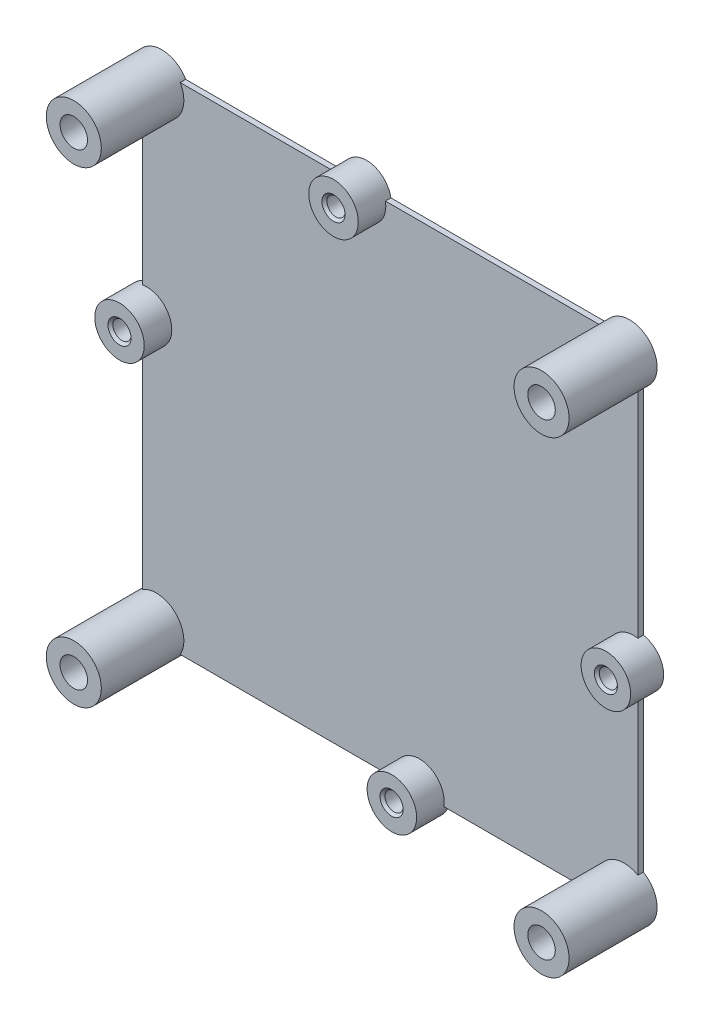
ISO-10303-21;
HEADER;
FILE_DESCRIPTION(('STEP AP214'),'2;1');
FILE_NAME('part.step','',(''),(''),'','','');
FILE_SCHEMA(('AUTOMOTIVE_DESIGN { 1 0 10303 214 1 1 1 1 }'));
ENDSEC;
DATA;
#1=APPLICATION_CONTEXT('core data for automotive mechanical design processes');
#2=APPLICATION_PROTOCOL_DEFINITION('international standard','automotive_design',2000,#1);
#3=PRODUCT_CONTEXT('',#1,'mechanical');
#4=PRODUCT('Part','Part','',(#3));
#5=PRODUCT_RELATED_PRODUCT_CATEGORY('part','',(#4));
#6=PRODUCT_DEFINITION_FORMATION('','',#4);
#7=PRODUCT_DEFINITION_CONTEXT('part definition',#1,'design');
#8=PRODUCT_DEFINITION('design','',#6,#7);
#9=PRODUCT_DEFINITION_SHAPE('','',#8);
#10=(LENGTH_UNIT() NAMED_UNIT(*) SI_UNIT(.MILLI.,.METRE.));
#11=(NAMED_UNIT(*) PLANE_ANGLE_UNIT() SI_UNIT($,.RADIAN.));
#12=(NAMED_UNIT(*) SI_UNIT($,.STERADIAN.) SOLID_ANGLE_UNIT());
#13=UNCERTAINTY_MEASURE_WITH_UNIT(LENGTH_MEASURE(1.E-05),#10,'distance_accuracy_value','');
#14=(GEOMETRIC_REPRESENTATION_CONTEXT(3) GLOBAL_UNCERTAINTY_ASSIGNED_CONTEXT((#13)) GLOBAL_UNIT_ASSIGNED_CONTEXT((#10,
#11,#12)) REPRESENTATION_CONTEXT('',''));
#15=CARTESIAN_POINT('',(0.,0.,0.));
#16=DIRECTION('',(0.,0.,1.));
#17=DIRECTION('',(1.,0.,0.));
#18=AXIS2_PLACEMENT_3D('',#15,#16,#17);
#19=CARTESIAN_POINT('',(45.,45.,1.));
#20=DIRECTION('',(-1.,0.,0.));
#21=DIRECTION('',(0.,-1.,0.));
#22=AXIS2_PLACEMENT_3D('',#19,#20,#21);
#23=PLANE('',#22);
#24=DIRECTION('',(0.,1.,0.));
#25=VECTOR('',#24,1.);
#26=CARTESIAN_POINT('',(45.,45.,0.));
#27=LINE('',#26,#25);
#28=CARTESIAN_POINT('',(45.,-38.1698729810778,0.));
#29=VERTEX_POINT('',#28);
#30=CARTESIAN_POINT('',(45.,-9.7305623346118,0.));
#31=VERTEX_POINT('',#30);
#32=EDGE_CURVE('E170',#29,#31,#27,.T.);
#33=ORIENTED_EDGE('',*,*,#32,.T.);
#34=DIRECTION('',(0.,0.,1.));
#35=VECTOR('',#34,1.);
#36=CARTESIAN_POINT('',(45.,-9.7305623346118,0.));
#37=LINE('',#36,#35);
#38=CARTESIAN_POINT('',(45.,-9.7305623346118,1.));
#39=VERTEX_POINT('',#38);
#40=EDGE_CURVE('E168',#31,#39,#37,.T.);
#41=ORIENTED_EDGE('',*,*,#40,.T.);
#42=DIRECTION('',(0.,1.,0.));
#43=VECTOR('',#42,1.);
#44=CARTESIAN_POINT('',(45.,45.,1.));
#45=LINE('',#44,#43);
#46=CARTESIAN_POINT('',(45.,-38.1698729810778,1.));
#47=VERTEX_POINT('',#46);
#48=EDGE_CURVE('E156',#47,#39,#45,.T.);
#49=ORIENTED_EDGE('',*,*,#48,.F.);
#50=DIRECTION('',(0.,0.,1.));
#51=VECTOR('',#50,1.);
#52=CARTESIAN_POINT('',(45.,-38.1698729810778,0.));
#53=LINE('',#52,#51);
#54=EDGE_CURVE('E283',#47,#29,#53,.F.);
#55=ORIENTED_EDGE('',*,*,#54,.T.);
#56=EDGE_LOOP('',(#33,#41,#49,#55));
#57=FACE_BOUND('',#56,.T.);
#58=ADVANCED_FACE('F43',(#57),#23,.F.);
#59=CARTESIAN_POINT('',(-45.,-45.,1.));
#60=DIRECTION('',(0.,1.,0.));
#61=DIRECTION('',(0.,0.,1.));
#62=AXIS2_PLACEMENT_3D('',#59,#60,#61);
#63=PLANE('',#62);
#64=DIRECTION('',(1.,0.,0.));
#65=VECTOR('',#64,1.);
#66=CARTESIAN_POINT('',(-45.,-45.,0.));
#67=LINE('',#66,#65);
#68=CARTESIAN_POINT('',(-38.1698729810778,-45.,0.));
#69=VERTEX_POINT('',#68);
#70=CARTESIAN_POINT('',(0.876039383186401,-45.,0.));
#71=VERTEX_POINT('',#70);
#72=EDGE_CURVE('E370',#69,#71,#67,.T.);
#73=ORIENTED_EDGE('',*,*,#72,.T.);
#74=DIRECTION('',(0.,0.,1.));
#75=VECTOR('',#74,1.);
#76=CARTESIAN_POINT('',(0.8760393831864,-45.,0.));
#77=LINE('',#76,#75);
#78=CARTESIAN_POINT('',(0.876039383186401,-45.,1.));
#79=VERTEX_POINT('',#78);
#80=EDGE_CURVE('E203',#71,#79,#77,.T.);
#81=ORIENTED_EDGE('',*,*,#80,.T.);
#82=DIRECTION('',(1.,0.,0.));
#83=VECTOR('',#82,1.);
#84=CARTESIAN_POINT('',(-45.,-45.,1.));
#85=LINE('',#84,#83);
#86=CARTESIAN_POINT('',(-38.1698729810778,-45.,1.));
#87=VERTEX_POINT('',#86);
#88=EDGE_CURVE('E11',#87,#79,#85,.T.);
#89=ORIENTED_EDGE('',*,*,#88,.F.);
#90=DIRECTION('',(0.,0.,1.));
#91=VECTOR('',#90,1.);
#92=CARTESIAN_POINT('',(-38.1698729810778,-45.,0.));
#93=LINE('',#92,#91);
#94=EDGE_CURVE('E317',#87,#69,#93,.F.);
#95=ORIENTED_EDGE('',*,*,#94,.T.);
#96=EDGE_LOOP('',(#73,#81,#89,#95));
#97=FACE_BOUND('',#96,.T.);
#98=ADVANCED_FACE('F443',(#97),#63,.F.);
#99=CARTESIAN_POINT('',(-45.,45.,1.));
#100=DIRECTION('',(0.,-1.,0.));
#101=DIRECTION('',(0.,0.,-1.));
#102=AXIS2_PLACEMENT_3D('',#99,#100,#101);
#103=PLANE('',#102);
#104=DIRECTION('',(-1.,0.,0.));
#105=VECTOR('',#104,1.);
#106=CARTESIAN_POINT('',(-45.,45.,0.));
#107=LINE('',#106,#105);
#108=CARTESIAN_POINT('',(38.1698729810778,45.,0.));
#109=VERTEX_POINT('',#108);
#110=CARTESIAN_POINT('',(-0.87603938318641,45.,0.));
#111=VERTEX_POINT('',#110);
#112=EDGE_CURVE('E362',#109,#111,#107,.T.);
#113=ORIENTED_EDGE('',*,*,#112,.T.);
#114=DIRECTION('',(0.,0.,1.));
#115=VECTOR('',#114,1.);
#116=CARTESIAN_POINT('',(-0.876039383186409,45.,0.));
#117=LINE('',#116,#115);
#118=CARTESIAN_POINT('',(-0.87603938318641,45.,1.));
#119=VERTEX_POINT('',#118);
#120=EDGE_CURVE('E222',#111,#119,#117,.T.);
#121=ORIENTED_EDGE('',*,*,#120,.T.);
#122=DIRECTION('',(-1.,0.,0.));
#123=VECTOR('',#122,1.);
#124=CARTESIAN_POINT('',(-45.,45.,1.));
#125=LINE('',#124,#123);
#126=CARTESIAN_POINT('',(38.1698729810778,45.,1.));
#127=VERTEX_POINT('',#126);
#128=EDGE_CURVE('E352',#127,#119,#125,.T.);
#129=ORIENTED_EDGE('',*,*,#128,.F.);
#130=DIRECTION('',(0.,0.,1.));
#131=VECTOR('',#130,1.);
#132=CARTESIAN_POINT('',(38.1698729810778,45.,0.));
#133=LINE('',#132,#131);
#134=EDGE_CURVE('E298',#127,#109,#133,.F.);
#135=ORIENTED_EDGE('',*,*,#134,.T.);
#136=EDGE_LOOP('',(#113,#121,#129,#135));
#137=FACE_BOUND('',#136,.T.);
#138=ADVANCED_FACE('F478',(#137),#103,.F.);
#139=CARTESIAN_POINT('',(-45.,45.,1.));
#140=DIRECTION('',(1.,0.,0.));
#141=DIRECTION('',(0.,1.,0.));
#142=AXIS2_PLACEMENT_3D('',#139,#140,#141);
#143=PLANE('',#142);
#144=DIRECTION('',(0.,-1.,0.));
#145=VECTOR('',#144,1.);
#146=CARTESIAN_POINT('',(-45.,45.,0.));
#147=LINE('',#146,#145);
#148=CARTESIAN_POINT('',(-45.,38.1698729810778,0.));
#149=VERTEX_POINT('',#148);
#150=CARTESIAN_POINT('',(-45.,9.73056233461181,0.));
#151=VERTEX_POINT('',#150);
#152=EDGE_CURVE('E366',#149,#151,#147,.T.);
#153=ORIENTED_EDGE('',*,*,#152,.T.);
#154=DIRECTION('',(0.,0.,1.));
#155=VECTOR('',#154,1.);
#156=CARTESIAN_POINT('',(-45.,9.73056233461181,0.));
#157=LINE('',#156,#155);
#158=CARTESIAN_POINT('',(-45.,9.73056233461181,1.));
#159=VERTEX_POINT('',#158);
#160=EDGE_CURVE('E241',#151,#159,#157,.T.);
#161=ORIENTED_EDGE('',*,*,#160,.T.);
#162=DIRECTION('',(0.,-1.,0.));
#163=VECTOR('',#162,1.);
#164=CARTESIAN_POINT('',(-45.,45.,1.));
#165=LINE('',#164,#163);
#166=CARTESIAN_POINT('',(-45.,38.1698729810778,1.));
#167=VERTEX_POINT('',#166);
#168=EDGE_CURVE('E356',#167,#159,#165,.T.);
#169=ORIENTED_EDGE('',*,*,#168,.F.);
#170=DIRECTION('',(0.,0.,1.));
#171=VECTOR('',#170,1.);
#172=CARTESIAN_POINT('',(-45.,38.1698729810778,0.));
#173=LINE('',#172,#171);
#174=EDGE_CURVE('E344',#167,#149,#173,.F.);
#175=ORIENTED_EDGE('',*,*,#174,.T.);
#176=EDGE_LOOP('',(#153,#161,#169,#175));
#177=FACE_BOUND('',#176,.T.);
#178=ADVANCED_FACE('F461',(#177),#143,.F.);
#179=CARTESIAN_POINT('',(45.,-0.876039383186402,1.));
#180=VERTEX_POINT('',#179);
#181=CARTESIAN_POINT('',(45.,38.1698729810778,1.));
#182=VERTEX_POINT('',#181);
#183=EDGE_CURVE('E165',#180,#182,#45,.T.);
#184=ORIENTED_EDGE('',*,*,#183,.F.);
#185=DIRECTION('',(0.,0.,1.));
#186=VECTOR('',#185,1.);
#187=CARTESIAN_POINT('',(45.,-0.876039383186401,0.));
#188=LINE('',#187,#186);
#189=CARTESIAN_POINT('',(45.,-0.876039383186402,0.));
#190=VERTEX_POINT('',#189);
#191=EDGE_CURVE('E68',#180,#190,#188,.F.);
#192=ORIENTED_EDGE('',*,*,#191,.T.);
#193=CARTESIAN_POINT('',(45.,38.1698729810778,0.));
#194=VERTEX_POINT('',#193);
#195=EDGE_CURVE('E350',#190,#194,#27,.T.);
#196=ORIENTED_EDGE('',*,*,#195,.T.);
#197=DIRECTION('',(0.,0.,1.));
#198=VECTOR('',#197,1.);
#199=CARTESIAN_POINT('',(45.,38.1698729810778,0.));
#200=LINE('',#199,#198);
#201=EDGE_CURVE('E301',#194,#182,#200,.T.);
#202=ORIENTED_EDGE('',*,*,#201,.T.);
#203=EDGE_LOOP('',(#184,#192,#196,#202));
#204=FACE_BOUND('',#203,.T.);
#205=ADVANCED_FACE('F45',(#204),#23,.F.);
#206=CARTESIAN_POINT('',(-9.73056233461181,45.,1.));
#207=VERTEX_POINT('',#206);
#208=CARTESIAN_POINT('',(-38.1698729810778,45.,1.));
#209=VERTEX_POINT('',#208);
#210=EDGE_CURVE('E164',#207,#209,#125,.T.);
#211=ORIENTED_EDGE('',*,*,#210,.F.);
#212=DIRECTION('',(0.,0.,1.));
#213=VECTOR('',#212,1.);
#214=CARTESIAN_POINT('',(-9.73056233461181,45.,0.));
#215=LINE('',#214,#213);
#216=CARTESIAN_POINT('',(-9.73056233461181,45.,0.));
#217=VERTEX_POINT('',#216);
#218=EDGE_CURVE('E219',#207,#217,#215,.F.);
#219=ORIENTED_EDGE('',*,*,#218,.T.);
#220=CARTESIAN_POINT('',(-38.1698729810778,45.,0.));
#221=VERTEX_POINT('',#220);
#222=EDGE_CURVE('E361',#217,#221,#107,.T.);
#223=ORIENTED_EDGE('',*,*,#222,.T.);
#224=DIRECTION('',(0.,0.,1.));
#225=VECTOR('',#224,1.);
#226=CARTESIAN_POINT('',(-38.1698729810778,45.,0.));
#227=LINE('',#226,#225);
#228=EDGE_CURVE('E347',#221,#209,#227,.T.);
#229=ORIENTED_EDGE('',*,*,#228,.T.);
#230=EDGE_LOOP('',(#211,#219,#223,#229));
#231=FACE_BOUND('',#230,.T.);
#232=ADVANCED_FACE('F470',(#231),#103,.F.);
#233=CARTESIAN_POINT('',(-45.,0.876039383186398,1.));
#234=VERTEX_POINT('',#233);
#235=CARTESIAN_POINT('',(-45.,-38.1698729810778,1.));
#236=VERTEX_POINT('',#235);
#237=EDGE_CURVE('E355',#234,#236,#165,.T.);
#238=ORIENTED_EDGE('',*,*,#237,.F.);
#239=DIRECTION('',(0.,0.,1.));
#240=VECTOR('',#239,1.);
#241=CARTESIAN_POINT('',(-45.,0.876039383186397,0.));
#242=LINE('',#241,#240);
#243=CARTESIAN_POINT('',(-45.,0.876039383186398,0.));
#244=VERTEX_POINT('',#243);
#245=EDGE_CURVE('E238',#234,#244,#242,.F.);
#246=ORIENTED_EDGE('',*,*,#245,.T.);
#247=CARTESIAN_POINT('',(-45.,-38.1698729810778,0.));
#248=VERTEX_POINT('',#247);
#249=EDGE_CURVE('E365',#244,#248,#147,.T.);
#250=ORIENTED_EDGE('',*,*,#249,.T.);
#251=DIRECTION('',(0.,0.,1.));
#252=VECTOR('',#251,1.);
#253=CARTESIAN_POINT('',(-45.,-38.1698729810778,0.));
#254=LINE('',#253,#252);
#255=EDGE_CURVE('E320',#248,#236,#254,.T.);
#256=ORIENTED_EDGE('',*,*,#255,.T.);
#257=EDGE_LOOP('',(#238,#246,#250,#256));
#258=FACE_BOUND('',#257,.T.);
#259=ADVANCED_FACE('F452',(#258),#143,.F.);
#260=CARTESIAN_POINT('',(9.73056233461182,-45.,1.));
#261=VERTEX_POINT('',#260);
#262=CARTESIAN_POINT('',(38.1698729810778,-45.,1.));
#263=VERTEX_POINT('',#262);
#264=EDGE_CURVE('E53',#261,#263,#85,.T.);
#265=ORIENTED_EDGE('',*,*,#264,.F.);
#266=DIRECTION('',(0.,0.,1.));
#267=VECTOR('',#266,1.);
#268=CARTESIAN_POINT('',(9.73056233461182,-45.,0.));
#269=LINE('',#268,#267);
#270=CARTESIAN_POINT('',(9.73056233461182,-45.,0.));
#271=VERTEX_POINT('',#270);
#272=EDGE_CURVE('E200',#261,#271,#269,.F.);
#273=ORIENTED_EDGE('',*,*,#272,.T.);
#274=CARTESIAN_POINT('',(38.1698729810778,-45.,0.));
#275=VERTEX_POINT('',#274);
#276=EDGE_CURVE('E369',#271,#275,#67,.T.);
#277=ORIENTED_EDGE('',*,*,#276,.T.);
#278=DIRECTION('',(0.,0.,1.));
#279=VECTOR('',#278,1.);
#280=CARTESIAN_POINT('',(38.1698729810778,-45.,0.));
#281=LINE('',#280,#279);
#282=EDGE_CURVE('E279',#275,#263,#281,.T.);
#283=ORIENTED_EDGE('',*,*,#282,.T.);
#284=EDGE_LOOP('',(#265,#273,#277,#283));
#285=FACE_BOUND('',#284,.T.);
#286=ADVANCED_FACE('F432',(#285),#63,.F.);
#287=CARTESIAN_POINT('',(0.,0.,1.));
#288=DIRECTION('',(0.,0.,1.));
#289=DIRECTION('',(1.,0.,0.));
#290=AXIS2_PLACEMENT_3D('',#287,#288,#289);
#291=PLANE('',#290);
#292=CARTESIAN_POINT('',(44.1941738241592,-5.3033008588991,1.));
#293=DIRECTION('',(0.,0.,1.));
#294=DIRECTION('',(1.,0.,0.));
#295=AXIS2_PLACEMENT_3D('',#292,#293,#294);
#296=CIRCLE('',#295,4.5);
#297=EDGE_CURVE('E61',#180,#39,#296,.T.);
#298=ORIENTED_EDGE('',*,*,#297,.F.);
#299=ORIENTED_EDGE('',*,*,#183,.T.);
#300=CARTESIAN_POINT('',(42.5,42.5,1.));
#301=DIRECTION('',(0.,0.,1.));
#302=DIRECTION('',(1.,0.,0.));
#303=AXIS2_PLACEMENT_3D('',#300,#301,#302);
#304=CIRCLE('',#303,5.);
#305=EDGE_CURVE('E294',#127,#182,#304,.T.);
#306=ORIENTED_EDGE('',*,*,#305,.F.);
#307=ORIENTED_EDGE('',*,*,#128,.T.);
#308=CARTESIAN_POINT('',(-5.30330085889911,44.1941738241592,1.));
#309=DIRECTION('',(0.,0.,1.));
#310=DIRECTION('',(1.,0.,0.));
#311=AXIS2_PLACEMENT_3D('',#308,#309,#310);
#312=CIRCLE('',#311,4.5);
#313=EDGE_CURVE('E215',#207,#119,#312,.T.);
#314=ORIENTED_EDGE('',*,*,#313,.F.);
#315=ORIENTED_EDGE('',*,*,#210,.T.);
#316=CARTESIAN_POINT('',(-42.5,42.5,1.));
#317=DIRECTION('',(0.,0.,1.));
#318=DIRECTION('',(1.,0.,0.));
#319=AXIS2_PLACEMENT_3D('',#316,#317,#318);
#320=CIRCLE('',#319,5.);
#321=EDGE_CURVE('E340',#167,#209,#320,.T.);
#322=ORIENTED_EDGE('',*,*,#321,.F.);
#323=ORIENTED_EDGE('',*,*,#168,.T.);
#324=CARTESIAN_POINT('',(-44.1941738241592,5.3033008588991,1.));
#325=DIRECTION('',(0.,0.,1.));
#326=DIRECTION('',(1.,0.,0.));
#327=AXIS2_PLACEMENT_3D('',#324,#325,#326);
#328=CIRCLE('',#327,4.5);
#329=EDGE_CURVE('E234',#234,#159,#328,.T.);
#330=ORIENTED_EDGE('',*,*,#329,.F.);
#331=ORIENTED_EDGE('',*,*,#237,.T.);
#332=CARTESIAN_POINT('',(-42.5,-42.5,1.));
#333=DIRECTION('',(0.,0.,1.));
#334=DIRECTION('',(1.,0.,0.));
#335=AXIS2_PLACEMENT_3D('',#332,#333,#334);
#336=CIRCLE('',#335,5.);
#337=EDGE_CURVE('E313',#87,#236,#336,.T.);
#338=ORIENTED_EDGE('',*,*,#337,.F.);
#339=ORIENTED_EDGE('',*,*,#88,.T.);
#340=CARTESIAN_POINT('',(5.30330085889911,-44.1941738241592,1.));
#341=DIRECTION('',(0.,0.,1.));
#342=DIRECTION('',(1.,0.,0.));
#343=AXIS2_PLACEMENT_3D('',#340,#341,#342);
#344=CIRCLE('',#343,4.50000000000001);
#345=EDGE_CURVE('E196',#261,#79,#344,.T.);
#346=ORIENTED_EDGE('',*,*,#345,.F.);
#347=ORIENTED_EDGE('',*,*,#264,.T.);
#348=CARTESIAN_POINT('',(42.5,-42.5,1.));
#349=DIRECTION('',(0.,0.,1.));
#350=DIRECTION('',(1.,0.,0.));
#351=AXIS2_PLACEMENT_3D('',#348,#349,#350);
#352=CIRCLE('',#351,5.);
#353=EDGE_CURVE('E160',#47,#263,#352,.T.);
#354=ORIENTED_EDGE('',*,*,#353,.F.);
#355=ORIENTED_EDGE('',*,*,#48,.T.);
#356=EDGE_LOOP('',(#298,#299,#306,#307,#314,#315,#322,#323,#330,#331,#338,#339,#346,#347,#354,#355));
#357=FACE_BOUND('',#356,.T.);
#358=ADVANCED_FACE('F158',(#357),#291,.T.);
#359=CARTESIAN_POINT('',(0.,0.,0.));
#360=DIRECTION('',(0.,0.,1.));
#361=DIRECTION('',(1.,0.,0.));
#362=AXIS2_PLACEMENT_3D('',#359,#360,#361);
#363=PLANE('',#362);
#364=CARTESIAN_POINT('',(5.24361296855425,-44.154400897952,0.));
#365=DIRECTION('',(0.,0.,1.));
#366=DIRECTION('',(1.,0.,0.));
#367=AXIS2_PLACEMENT_3D('',#364,#365,#366);
#368=CIRCLE('',#367,1.65);
#369=CARTESIAN_POINT('',(6.89361296855424,-44.154400897952,0.));
#370=VERTEX_POINT('',#369);
#371=EDGE_CURVE('E47',#370,#370,#368,.T.);
#372=ORIENTED_EDGE('',*,*,#371,.T.);
#373=EDGE_LOOP('',(#372));
#374=FACE_BOUND('',#373,.T.);
#375=CARTESIAN_POINT('',(44.1941738241592,-5.3033008588991,0.));
#376=DIRECTION('',(0.,0.,1.));
#377=DIRECTION('',(1.,0.,0.));
#378=AXIS2_PLACEMENT_3D('',#375,#376,#377);
#379=CIRCLE('',#378,1.65);
#380=CARTESIAN_POINT('',(45.8441738241592,-5.3033008588991,0.));
#381=VERTEX_POINT('',#380);
#382=EDGE_CURVE('E383',#381,#381,#379,.T.);
#383=ORIENTED_EDGE('',*,*,#382,.T.);
#384=EDGE_LOOP('',(#383));
#385=FACE_BOUND('',#384,.T.);
#386=CARTESIAN_POINT('',(-5.30330085889911,44.1941738241592,0.));
#387=DIRECTION('',(0.,0.,1.));
#388=DIRECTION('',(1.,0.,0.));
#389=AXIS2_PLACEMENT_3D('',#386,#387,#388);
#390=CIRCLE('',#389,1.65);
#391=CARTESIAN_POINT('',(-3.65330085889911,44.1941738241592,0.));
#392=VERTEX_POINT('',#391);
#393=EDGE_CURVE('E378',#392,#392,#390,.T.);
#394=ORIENTED_EDGE('',*,*,#393,.T.);
#395=EDGE_LOOP('',(#394));
#396=FACE_BOUND('',#395,.T.);
#397=CARTESIAN_POINT('',(-44.1941738241592,5.3033008588991,0.));
#398=DIRECTION('',(0.,0.,1.));
#399=DIRECTION('',(1.,0.,0.));
#400=AXIS2_PLACEMENT_3D('',#397,#398,#399);
#401=CIRCLE('',#400,1.65);
#402=CARTESIAN_POINT('',(-42.5441738241592,5.3033008588991,0.));
#403=VERTEX_POINT('',#402);
#404=EDGE_CURVE('E373',#403,#403,#401,.T.);
#405=ORIENTED_EDGE('',*,*,#404,.T.);
#406=EDGE_LOOP('',(#405));
#407=FACE_BOUND('',#406,.T.);
#408=CARTESIAN_POINT('',(-42.5,-42.5,0.));
#409=DIRECTION('',(0.,0.,1.));
#410=DIRECTION('',(1.,0.,0.));
#411=AXIS2_PLACEMENT_3D('',#408,#409,#410);
#412=CIRCLE('',#411,2.5);
#413=CARTESIAN_POINT('',(-40.,-42.5,0.));
#414=VERTEX_POINT('',#413);
#415=EDGE_CURVE('E265',#414,#414,#412,.T.);
#416=ORIENTED_EDGE('',*,*,#415,.T.);
#417=EDGE_LOOP('',(#416));
#418=FACE_BOUND('',#417,.T.);
#419=CARTESIAN_POINT('',(42.5,42.5,0.));
#420=DIRECTION('',(0.,0.,1.));
#421=DIRECTION('',(1.,0.,0.));
#422=AXIS2_PLACEMENT_3D('',#419,#420,#421);
#423=CIRCLE('',#422,2.5);
#424=CARTESIAN_POINT('',(45.,42.5,0.));
#425=VERTEX_POINT('',#424);
#426=EDGE_CURVE('E261',#425,#425,#423,.T.);
#427=ORIENTED_EDGE('',*,*,#426,.T.);
#428=EDGE_LOOP('',(#427));
#429=FACE_BOUND('',#428,.T.);
#430=CARTESIAN_POINT('',(42.5,-42.5,0.));
#431=DIRECTION('',(0.,0.,1.));
#432=DIRECTION('',(1.,0.,0.));
#433=AXIS2_PLACEMENT_3D('',#430,#431,#432);
#434=CIRCLE('',#433,2.5);
#435=CARTESIAN_POINT('',(45.,-42.5,0.));
#436=VERTEX_POINT('',#435);
#437=EDGE_CURVE('E250',#436,#436,#434,.T.);
#438=ORIENTED_EDGE('',*,*,#437,.T.);
#439=EDGE_LOOP('',(#438));
#440=FACE_BOUND('',#439,.T.);
#441=ORIENTED_EDGE('',*,*,#195,.F.);
#442=CARTESIAN_POINT('',(44.1941738241592,-5.3033008588991,0.));
#443=DIRECTION('',(0.,0.,1.));
#444=DIRECTION('',(1.,0.,0.));
#445=AXIS2_PLACEMENT_3D('',#442,#443,#444);
#446=CIRCLE('',#445,4.5);
#447=EDGE_CURVE('E185',#31,#190,#446,.T.);
#448=ORIENTED_EDGE('',*,*,#447,.F.);
#449=ORIENTED_EDGE('',*,*,#32,.F.);
#450=CARTESIAN_POINT('',(42.5,-42.5,0.));
#451=DIRECTION('',(0.,0.,1.));
#452=DIRECTION('',(1.,0.,0.));
#453=AXIS2_PLACEMENT_3D('',#450,#451,#452);
#454=CIRCLE('',#453,5.);
#455=EDGE_CURVE('E273',#275,#29,#454,.T.);
#456=ORIENTED_EDGE('',*,*,#455,.F.);
#457=ORIENTED_EDGE('',*,*,#276,.F.);
#458=CARTESIAN_POINT('',(5.30330085889911,-44.1941738241592,0.));
#459=DIRECTION('',(0.,0.,1.));
#460=DIRECTION('',(1.,0.,0.));
#461=AXIS2_PLACEMENT_3D('',#458,#459,#460);
#462=CIRCLE('',#461,4.50000000000001);
#463=EDGE_CURVE('E175',#71,#271,#462,.T.);
#464=ORIENTED_EDGE('',*,*,#463,.F.);
#465=ORIENTED_EDGE('',*,*,#72,.F.);
#466=CARTESIAN_POINT('',(-42.5,-42.5,0.));
#467=DIRECTION('',(0.,0.,1.));
#468=DIRECTION('',(1.,0.,0.));
#469=AXIS2_PLACEMENT_3D('',#466,#467,#468);
#470=CIRCLE('',#469,5.);
#471=EDGE_CURVE('E309',#248,#69,#470,.T.);
#472=ORIENTED_EDGE('',*,*,#471,.F.);
#473=ORIENTED_EDGE('',*,*,#249,.F.);
#474=CARTESIAN_POINT('',(-44.1941738241592,5.3033008588991,0.));
#475=DIRECTION('',(0.,0.,1.));
#476=DIRECTION('',(1.,0.,0.));
#477=AXIS2_PLACEMENT_3D('',#474,#475,#476);
#478=CIRCLE('',#477,4.5);
#479=EDGE_CURVE('E230',#151,#244,#478,.T.);
#480=ORIENTED_EDGE('',*,*,#479,.F.);
#481=ORIENTED_EDGE('',*,*,#152,.F.);
#482=CARTESIAN_POINT('',(-42.5,42.5,0.));
#483=DIRECTION('',(0.,0.,1.));
#484=DIRECTION('',(1.,0.,0.));
#485=AXIS2_PLACEMENT_3D('',#482,#483,#484);
#486=CIRCLE('',#485,5.);
#487=EDGE_CURVE('E336',#221,#149,#486,.T.);
#488=ORIENTED_EDGE('',*,*,#487,.F.);
#489=ORIENTED_EDGE('',*,*,#222,.F.);
#490=CARTESIAN_POINT('',(-5.30330085889911,44.1941738241592,0.));
#491=DIRECTION('',(0.,0.,1.));
#492=DIRECTION('',(1.,0.,0.));
#493=AXIS2_PLACEMENT_3D('',#490,#491,#492);
#494=CIRCLE('',#493,4.5);
#495=EDGE_CURVE('E207',#111,#217,#494,.T.);
#496=ORIENTED_EDGE('',*,*,#495,.F.);
#497=ORIENTED_EDGE('',*,*,#112,.F.);
#498=CARTESIAN_POINT('',(42.5,42.5,0.));
#499=DIRECTION('',(0.,0.,1.));
#500=DIRECTION('',(1.,0.,0.));
#501=AXIS2_PLACEMENT_3D('',#498,#499,#500);
#502=CIRCLE('',#501,5.);
#503=EDGE_CURVE('E290',#194,#109,#502,.T.);
#504=ORIENTED_EDGE('',*,*,#503,.F.);
#505=EDGE_LOOP('',(#441,#448,#449,#456,#457,#464,#465,#472,#473,#480,#481,#488,#489,#496,#497,#504));
#506=FACE_BOUND('',#505,.T.);
#507=CARTESIAN_POINT('',(-42.5,42.5,0.));
#508=DIRECTION('',(0.,0.,1.));
#509=DIRECTION('',(1.,0.,0.));
#510=AXIS2_PLACEMENT_3D('',#507,#508,#509);
#511=CIRCLE('',#510,2.5);
#512=CARTESIAN_POINT('',(-40.,42.5,0.));
#513=VERTEX_POINT('',#512);
#514=EDGE_CURVE('E328',#513,#513,#511,.T.);
#515=ORIENTED_EDGE('',*,*,#514,.T.);
#516=EDGE_LOOP('',(#515));
#517=FACE_BOUND('',#516,.T.);
#518=ADVANCED_FACE('F414',(#374,#385,#396,#407,#418,#429,#440,#506,#517),#363,.F.);
#519=CARTESIAN_POINT('',(-42.5,42.5,0.));
#520=DIRECTION('',(0.,0.,1.));
#521=DIRECTION('',(1.,0.,0.));
#522=AXIS2_PLACEMENT_3D('',#519,#520,#521);
#523=CYLINDRICAL_SURFACE('',#522,5.);
#524=CARTESIAN_POINT('',(-42.5,42.5,16.));
#525=DIRECTION('',(0.,0.,1.));
#526=DIRECTION('',(1.,0.,0.));
#527=AXIS2_PLACEMENT_3D('',#524,#525,#526);
#528=CIRCLE('',#527,5.);
#529=CARTESIAN_POINT('',(-37.5,42.5,16.));
#530=VERTEX_POINT('',#529);
#531=EDGE_CURVE('E332',#530,#530,#528,.T.);
#532=ORIENTED_EDGE('',*,*,#531,.F.);
#533=EDGE_LOOP('',(#532));
#534=FACE_BOUND('',#533,.T.);
#535=ORIENTED_EDGE('',*,*,#228,.F.);
#536=ORIENTED_EDGE('',*,*,#487,.T.);
#537=ORIENTED_EDGE('',*,*,#174,.F.);
#538=ORIENTED_EDGE('',*,*,#321,.T.);
#539=EDGE_LOOP('',(#535,#536,#537,#538));
#540=FACE_BOUND('',#539,.T.);
#541=ADVANCED_FACE('F467',(#534,#540),#523,.T.);
#542=CARTESIAN_POINT('',(-42.5,42.5,16.));
#543=DIRECTION('',(0.,0.,1.));
#544=DIRECTION('',(1.,0.,0.));
#545=AXIS2_PLACEMENT_3D('',#542,#543,#544);
#546=PLANE('',#545);
#547=CARTESIAN_POINT('',(-42.5,42.5,16.));
#548=DIRECTION('',(0.,0.,1.));
#549=DIRECTION('',(1.,0.,0.));
#550=AXIS2_PLACEMENT_3D('',#547,#548,#549);
#551=CIRCLE('',#550,2.5);
#552=CARTESIAN_POINT('',(-40.,42.5,16.));
#553=VERTEX_POINT('',#552);
#554=EDGE_CURVE('E324',#553,#553,#551,.T.);
#555=ORIENTED_EDGE('',*,*,#554,.F.);
#556=EDGE_LOOP('',(#555));
#557=FACE_BOUND('',#556,.T.);
#558=ORIENTED_EDGE('',*,*,#531,.T.);
#559=EDGE_LOOP('',(#558));
#560=FACE_BOUND('',#559,.T.);
#561=ADVANCED_FACE('F633',(#557,#560),#546,.T.);
#562=CARTESIAN_POINT('',(-42.5,42.5,-84.));
#563=DIRECTION('',(0.,0.,1.));
#564=DIRECTION('',(1.,0.,0.));
#565=AXIS2_PLACEMENT_3D('',#562,#563,#564);
#566=CYLINDRICAL_SURFACE('',#565,2.5);
#567=ORIENTED_EDGE('',*,*,#554,.T.);
#568=EDGE_LOOP('',(#567));
#569=FACE_BOUND('',#568,.T.);
#570=ORIENTED_EDGE('',*,*,#514,.F.);
#571=EDGE_LOOP('',(#570));
#572=FACE_BOUND('',#571,.T.);
#573=ADVANCED_FACE('F622',(#569,#572),#566,.F.);
#574=CARTESIAN_POINT('',(-42.5,-42.5,0.));
#575=DIRECTION('',(0.,0.,1.));
#576=DIRECTION('',(1.,0.,0.));
#577=AXIS2_PLACEMENT_3D('',#574,#575,#576);
#578=CYLINDRICAL_SURFACE('',#577,5.);
#579=CARTESIAN_POINT('',(-42.5,-42.5,16.));
#580=DIRECTION('',(0.,0.,1.));
#581=DIRECTION('',(1.,0.,0.));
#582=AXIS2_PLACEMENT_3D('',#579,#580,#581);
#583=CIRCLE('',#582,5.);
#584=CARTESIAN_POINT('',(-37.5,-42.5,16.));
#585=VERTEX_POINT('',#584);
#586=EDGE_CURVE('E305',#585,#585,#583,.T.);
#587=ORIENTED_EDGE('',*,*,#586,.F.);
#588=EDGE_LOOP('',(#587));
#589=FACE_BOUND('',#588,.T.);
#590=ORIENTED_EDGE('',*,*,#255,.F.);
#591=ORIENTED_EDGE('',*,*,#471,.T.);
#592=ORIENTED_EDGE('',*,*,#94,.F.);
#593=ORIENTED_EDGE('',*,*,#337,.T.);
#594=EDGE_LOOP('',(#590,#591,#592,#593));
#595=FACE_BOUND('',#594,.T.);
#596=ADVANCED_FACE('F449',(#589,#595),#578,.T.);
#597=CARTESIAN_POINT('',(-42.5,-42.5,16.));
#598=DIRECTION('',(0.,0.,1.));
#599=DIRECTION('',(1.,0.,0.));
#600=AXIS2_PLACEMENT_3D('',#597,#598,#599);
#601=PLANE('',#600);
#602=CARTESIAN_POINT('',(-42.5,-42.5,16.));
#603=DIRECTION('',(0.,0.,1.));
#604=DIRECTION('',(1.,0.,0.));
#605=AXIS2_PLACEMENT_3D('',#602,#603,#604);
#606=CIRCLE('',#605,2.5);
#607=CARTESIAN_POINT('',(-40.,-42.5,16.));
#608=VERTEX_POINT('',#607);
#609=EDGE_CURVE('E246',#608,#608,#606,.T.);
#610=ORIENTED_EDGE('',*,*,#609,.F.);
#611=EDGE_LOOP('',(#610));
#612=FACE_BOUND('',#611,.T.);
#613=ORIENTED_EDGE('',*,*,#586,.T.);
#614=EDGE_LOOP('',(#613));
#615=FACE_BOUND('',#614,.T.);
#616=ADVANCED_FACE('F603',(#612,#615),#601,.T.);
#617=CARTESIAN_POINT('',(42.5,42.5,0.));
#618=DIRECTION('',(0.,0.,1.));
#619=DIRECTION('',(1.,0.,0.));
#620=AXIS2_PLACEMENT_3D('',#617,#618,#619);
#621=CYLINDRICAL_SURFACE('',#620,5.);
#622=CARTESIAN_POINT('',(42.5,42.5,16.));
#623=DIRECTION('',(0.,0.,1.));
#624=DIRECTION('',(1.,0.,0.));
#625=AXIS2_PLACEMENT_3D('',#622,#623,#624);
#626=CIRCLE('',#625,5.);
#627=CARTESIAN_POINT('',(47.5,42.5,16.));
#628=VERTEX_POINT('',#627);
#629=EDGE_CURVE('E286',#628,#628,#626,.T.);
#630=ORIENTED_EDGE('',*,*,#629,.F.);
#631=EDGE_LOOP('',(#630));
#632=FACE_BOUND('',#631,.T.);
#633=ORIENTED_EDGE('',*,*,#201,.F.);
#634=ORIENTED_EDGE('',*,*,#503,.T.);
#635=ORIENTED_EDGE('',*,*,#134,.F.);
#636=ORIENTED_EDGE('',*,*,#305,.T.);
#637=EDGE_LOOP('',(#633,#634,#635,#636));
#638=FACE_BOUND('',#637,.T.);
#639=ADVANCED_FACE('F481',(#632,#638),#621,.T.);
#640=CARTESIAN_POINT('',(42.5,42.5,16.));
#641=DIRECTION('',(0.,0.,1.));
#642=DIRECTION('',(1.,0.,0.));
#643=AXIS2_PLACEMENT_3D('',#640,#641,#642);
#644=PLANE('',#643);
#645=CARTESIAN_POINT('',(42.5,42.5,16.));
#646=DIRECTION('',(0.,0.,1.));
#647=DIRECTION('',(1.,0.,0.));
#648=AXIS2_PLACEMENT_3D('',#645,#646,#647);
#649=CIRCLE('',#648,2.5);
#650=CARTESIAN_POINT('',(45.,42.5,16.));
#651=VERTEX_POINT('',#650);
#652=EDGE_CURVE('E251',#651,#651,#649,.T.);
#653=ORIENTED_EDGE('',*,*,#652,.F.);
#654=EDGE_LOOP('',(#653));
#655=FACE_BOUND('',#654,.T.);
#656=ORIENTED_EDGE('',*,*,#629,.T.);
#657=EDGE_LOOP('',(#656));
#658=FACE_BOUND('',#657,.T.);
#659=ADVANCED_FACE('F584',(#655,#658),#644,.T.);
#660=CARTESIAN_POINT('',(42.5,-42.5,0.));
#661=DIRECTION('',(0.,0.,1.));
#662=DIRECTION('',(1.,0.,0.));
#663=AXIS2_PLACEMENT_3D('',#660,#661,#662);
#664=CYLINDRICAL_SURFACE('',#663,5.);
#665=CARTESIAN_POINT('',(42.5,-42.5,16.));
#666=DIRECTION('',(0.,0.,1.));
#667=DIRECTION('',(1.,0.,0.));
#668=AXIS2_PLACEMENT_3D('',#665,#666,#667);
#669=CIRCLE('',#668,5.);
#670=CARTESIAN_POINT('',(47.5,-42.5,16.));
#671=VERTEX_POINT('',#670);
#672=EDGE_CURVE('E269',#671,#671,#669,.T.);
#673=ORIENTED_EDGE('',*,*,#672,.F.);
#674=EDGE_LOOP('',(#673));
#675=FACE_BOUND('',#674,.T.);
#676=ORIENTED_EDGE('',*,*,#54,.F.);
#677=ORIENTED_EDGE('',*,*,#353,.T.);
#678=ORIENTED_EDGE('',*,*,#282,.F.);
#679=ORIENTED_EDGE('',*,*,#455,.T.);
#680=EDGE_LOOP('',(#676,#677,#678,#679));
#681=FACE_BOUND('',#680,.T.);
#682=ADVANCED_FACE('F435',(#675,#681),#664,.T.);
#683=CARTESIAN_POINT('',(42.5,-42.5,16.));
#684=DIRECTION('',(0.,0.,1.));
#685=DIRECTION('',(1.,0.,0.));
#686=AXIS2_PLACEMENT_3D('',#683,#684,#685);
#687=PLANE('',#686);
#688=CARTESIAN_POINT('',(42.5,-42.5,16.));
#689=DIRECTION('',(0.,0.,1.));
#690=DIRECTION('',(1.,0.,0.));
#691=AXIS2_PLACEMENT_3D('',#688,#689,#690);
#692=CIRCLE('',#691,2.5);
#693=CARTESIAN_POINT('',(45.,-42.5,16.));
#694=VERTEX_POINT('',#693);
#695=EDGE_CURVE('E245',#694,#694,#692,.T.);
#696=ORIENTED_EDGE('',*,*,#695,.F.);
#697=EDGE_LOOP('',(#696));
#698=FACE_BOUND('',#697,.T.);
#699=ORIENTED_EDGE('',*,*,#672,.T.);
#700=EDGE_LOOP('',(#699));
#701=FACE_BOUND('',#700,.T.);
#702=ADVANCED_FACE('F565',(#698,#701),#687,.T.);
#703=CARTESIAN_POINT('',(42.5,-42.5,-84.));
#704=DIRECTION('',(0.,0.,1.));
#705=DIRECTION('',(1.,0.,0.));
#706=AXIS2_PLACEMENT_3D('',#703,#704,#705);
#707=CYLINDRICAL_SURFACE('',#706,2.5);
#708=ORIENTED_EDGE('',*,*,#695,.T.);
#709=EDGE_LOOP('',(#708));
#710=FACE_BOUND('',#709,.T.);
#711=ORIENTED_EDGE('',*,*,#437,.F.);
#712=EDGE_LOOP('',(#711));
#713=FACE_BOUND('',#712,.T.);
#714=ADVANCED_FACE('F555',(#710,#713),#707,.F.);
#715=CARTESIAN_POINT('',(42.5,42.5,-84.));
#716=DIRECTION('',(0.,0.,1.));
#717=DIRECTION('',(1.,0.,0.));
#718=AXIS2_PLACEMENT_3D('',#715,#716,#717);
#719=CYLINDRICAL_SURFACE('',#718,2.5);
#720=ORIENTED_EDGE('',*,*,#652,.T.);
#721=EDGE_LOOP('',(#720));
#722=FACE_BOUND('',#721,.T.);
#723=ORIENTED_EDGE('',*,*,#426,.F.);
#724=EDGE_LOOP('',(#723));
#725=FACE_BOUND('',#724,.T.);
#726=ADVANCED_FACE('F544',(#722,#725),#719,.F.);
#727=CARTESIAN_POINT('',(-42.5,-42.5,-84.));
#728=DIRECTION('',(0.,0.,1.));
#729=DIRECTION('',(1.,0.,0.));
#730=AXIS2_PLACEMENT_3D('',#727,#728,#729);
#731=CYLINDRICAL_SURFACE('',#730,2.5);
#732=ORIENTED_EDGE('',*,*,#609,.T.);
#733=EDGE_LOOP('',(#732));
#734=FACE_BOUND('',#733,.T.);
#735=ORIENTED_EDGE('',*,*,#415,.F.);
#736=EDGE_LOOP('',(#735));
#737=FACE_BOUND('',#736,.T.);
#738=ADVANCED_FACE('F540',(#734,#737),#731,.F.);
#739=CARTESIAN_POINT('',(-44.1941738241592,5.3033008588991,0.));
#740=DIRECTION('',(0.,0.,1.));
#741=DIRECTION('',(1.,0.,0.));
#742=AXIS2_PLACEMENT_3D('',#739,#740,#741);
#743=CYLINDRICAL_SURFACE('',#742,4.5);
#744=CARTESIAN_POINT('',(-44.1941738241592,5.3033008588991,6.));
#745=DIRECTION('',(0.,0.,1.));
#746=DIRECTION('',(1.,0.,0.));
#747=AXIS2_PLACEMENT_3D('',#744,#745,#746);
#748=CIRCLE('',#747,4.5);
#749=CARTESIAN_POINT('',(-39.6941738241592,5.3033008588991,6.));
#750=VERTEX_POINT('',#749);
#751=EDGE_CURVE('E226',#750,#750,#748,.T.);
#752=ORIENTED_EDGE('',*,*,#751,.F.);
#753=EDGE_LOOP('',(#752));
#754=FACE_BOUND('',#753,.T.);
#755=ORIENTED_EDGE('',*,*,#160,.F.);
#756=ORIENTED_EDGE('',*,*,#479,.T.);
#757=ORIENTED_EDGE('',*,*,#245,.F.);
#758=ORIENTED_EDGE('',*,*,#329,.T.);
#759=EDGE_LOOP('',(#755,#756,#757,#758));
#760=FACE_BOUND('',#759,.T.);
#761=ADVANCED_FACE('F458',(#754,#760),#743,.T.);
#762=CARTESIAN_POINT('',(-44.1941738241592,5.3033008588991,6.));
#763=DIRECTION('',(0.,0.,1.));
#764=DIRECTION('',(1.,0.,0.));
#765=AXIS2_PLACEMENT_3D('',#762,#763,#764);
#766=PLANE('',#765);
#767=CARTESIAN_POINT('',(-44.1941738241592,5.3033008588991,6.));
#768=DIRECTION('',(0.,0.,1.));
#769=DIRECTION('',(1.,0.,0.));
#770=AXIS2_PLACEMENT_3D('',#767,#768,#769);
#771=CIRCLE('',#770,2.1);
#772=CARTESIAN_POINT('',(-42.0941738241592,5.3033008588991,6.));
#773=VERTEX_POINT('',#772);
#774=EDGE_CURVE('E381',#773,#773,#771,.T.);
#775=ORIENTED_EDGE('',*,*,#774,.F.);
#776=EDGE_LOOP('',(#775));
#777=FACE_BOUND('',#776,.T.);
#778=ORIENTED_EDGE('',*,*,#751,.T.);
#779=EDGE_LOOP('',(#778));
#780=FACE_BOUND('',#779,.T.);
#781=ADVANCED_FACE('F676',(#777,#780),#766,.T.);
#782=CARTESIAN_POINT('',(-5.30330085889911,44.1941738241592,0.));
#783=DIRECTION('',(0.,0.,1.));
#784=DIRECTION('',(1.,0.,0.));
#785=AXIS2_PLACEMENT_3D('',#782,#783,#784);
#786=CYLINDRICAL_SURFACE('',#785,4.5);
#787=CARTESIAN_POINT('',(-5.30330085889911,44.1941738241592,6.));
#788=DIRECTION('',(0.,0.,1.));
#789=DIRECTION('',(1.,0.,0.));
#790=AXIS2_PLACEMENT_3D('',#787,#788,#789);
#791=CIRCLE('',#790,4.5);
#792=CARTESIAN_POINT('',(-0.803300858899112,44.1941738241592,6.));
#793=VERTEX_POINT('',#792);
#794=EDGE_CURVE('E211',#793,#793,#791,.T.);
#795=ORIENTED_EDGE('',*,*,#794,.F.);
#796=EDGE_LOOP('',(#795));
#797=FACE_BOUND('',#796,.T.);
#798=ORIENTED_EDGE('',*,*,#120,.F.);
#799=ORIENTED_EDGE('',*,*,#495,.T.);
#800=ORIENTED_EDGE('',*,*,#218,.F.);
#801=ORIENTED_EDGE('',*,*,#313,.T.);
#802=EDGE_LOOP('',(#798,#799,#800,#801));
#803=FACE_BOUND('',#802,.T.);
#804=ADVANCED_FACE('F475',(#797,#803),#786,.T.);
#805=CARTESIAN_POINT('',(-5.30330085889911,44.1941738241592,6.));
#806=DIRECTION('',(0.,0.,1.));
#807=DIRECTION('',(1.,0.,0.));
#808=AXIS2_PLACEMENT_3D('',#805,#806,#807);
#809=PLANE('',#808);
#810=CARTESIAN_POINT('',(-5.30330085889911,44.1941738241592,6.));
#811=DIRECTION('',(0.,0.,1.));
#812=DIRECTION('',(1.,0.,0.));
#813=AXIS2_PLACEMENT_3D('',#810,#811,#812);
#814=CIRCLE('',#813,2.1);
#815=CARTESIAN_POINT('',(-3.20330085889911,44.1941738241592,6.));
#816=VERTEX_POINT('',#815);
#817=EDGE_CURVE('E386',#816,#816,#814,.T.);
#818=ORIENTED_EDGE('',*,*,#817,.F.);
#819=EDGE_LOOP('',(#818));
#820=FACE_BOUND('',#819,.T.);
#821=ORIENTED_EDGE('',*,*,#794,.T.);
#822=EDGE_LOOP('',(#821));
#823=FACE_BOUND('',#822,.T.);
#824=ADVANCED_FACE('F688',(#820,#823),#809,.T.);
#825=CARTESIAN_POINT('',(5.30330085889911,-44.1941738241592,0.));
#826=DIRECTION('',(0.,0.,1.));
#827=DIRECTION('',(1.,0.,0.));
#828=AXIS2_PLACEMENT_3D('',#825,#826,#827);
#829=CYLINDRICAL_SURFACE('',#828,4.50000000000001);
#830=CARTESIAN_POINT('',(5.30330085889911,-44.1941738241592,6.));
#831=DIRECTION('',(0.,0.,1.));
#832=DIRECTION('',(1.,0.,0.));
#833=AXIS2_PLACEMENT_3D('',#830,#831,#832);
#834=CIRCLE('',#833,4.50000000000001);
#835=CARTESIAN_POINT('',(9.80330085889911,-44.1941738241592,6.));
#836=VERTEX_POINT('',#835);
#837=EDGE_CURVE('E192',#836,#836,#834,.T.);
#838=ORIENTED_EDGE('',*,*,#837,.F.);
#839=EDGE_LOOP('',(#838));
#840=FACE_BOUND('',#839,.T.);
#841=ORIENTED_EDGE('',*,*,#80,.F.);
#842=ORIENTED_EDGE('',*,*,#463,.T.);
#843=ORIENTED_EDGE('',*,*,#272,.F.);
#844=ORIENTED_EDGE('',*,*,#345,.T.);
#845=EDGE_LOOP('',(#841,#842,#843,#844));
#846=FACE_BOUND('',#845,.T.);
#847=ADVANCED_FACE('F440',(#840,#846),#829,.T.);
#848=CARTESIAN_POINT('',(5.30330085889911,-44.1941738241592,6.));
#849=DIRECTION('',(0.,0.,1.));
#850=DIRECTION('',(1.,0.,0.));
#851=AXIS2_PLACEMENT_3D('',#848,#849,#850);
#852=PLANE('',#851);
#853=CARTESIAN_POINT('',(5.24361296855425,-44.154400897952,6.));
#854=DIRECTION('',(0.,0.,1.));
#855=DIRECTION('',(1.,0.,0.));
#856=AXIS2_PLACEMENT_3D('',#853,#854,#855);
#857=CIRCLE('',#856,2.1);
#858=CARTESIAN_POINT('',(7.34361296855425,-44.154400897952,6.));
#859=VERTEX_POINT('',#858);
#860=EDGE_CURVE('E858',#859,#859,#857,.T.);
#861=ORIENTED_EDGE('',*,*,#860,.F.);
#862=EDGE_LOOP('',(#861));
#863=FACE_BOUND('',#862,.T.);
#864=ORIENTED_EDGE('',*,*,#837,.T.);
#865=EDGE_LOOP('',(#864));
#866=FACE_BOUND('',#865,.T.);
#867=ADVANCED_FACE('F699',(#863,#866),#852,.T.);
#868=CARTESIAN_POINT('',(44.1941738241592,-5.3033008588991,0.));
#869=DIRECTION('',(0.,0.,1.));
#870=DIRECTION('',(1.,0.,0.));
#871=AXIS2_PLACEMENT_3D('',#868,#869,#870);
#872=CYLINDRICAL_SURFACE('',#871,4.5);
#873=CARTESIAN_POINT('',(44.1941738241592,-5.3033008588991,6.));
#874=DIRECTION('',(0.,0.,1.));
#875=DIRECTION('',(1.,0.,0.));
#876=AXIS2_PLACEMENT_3D('',#873,#874,#875);
#877=CIRCLE('',#876,4.5);
#878=CARTESIAN_POINT('',(48.6941738241592,-5.3033008588991,6.));
#879=VERTEX_POINT('',#878);
#880=EDGE_CURVE('E179',#879,#879,#877,.T.);
#881=ORIENTED_EDGE('',*,*,#880,.F.);
#882=EDGE_LOOP('',(#881));
#883=FACE_BOUND('',#882,.T.);
#884=ORIENTED_EDGE('',*,*,#40,.F.);
#885=ORIENTED_EDGE('',*,*,#447,.T.);
#886=ORIENTED_EDGE('',*,*,#191,.F.);
#887=ORIENTED_EDGE('',*,*,#297,.T.);
#888=EDGE_LOOP('',(#884,#885,#886,#887));
#889=FACE_BOUND('',#888,.T.);
#890=ADVANCED_FACE('F177',(#883,#889),#872,.T.);
#891=CARTESIAN_POINT('',(44.1941738241592,-5.3033008588991,6.));
#892=DIRECTION('',(0.,0.,1.));
#893=DIRECTION('',(1.,0.,0.));
#894=AXIS2_PLACEMENT_3D('',#891,#892,#893);
#895=PLANE('',#894);
#896=CARTESIAN_POINT('',(44.1941738241592,-5.3033008588991,6.));
#897=DIRECTION('',(0.,0.,1.));
#898=DIRECTION('',(1.,0.,0.));
#899=AXIS2_PLACEMENT_3D('',#896,#897,#898);
#900=CIRCLE('',#899,2.1);
#901=CARTESIAN_POINT('',(46.2941738241592,-5.3033008588991,6.));
#902=VERTEX_POINT('',#901);
#903=EDGE_CURVE('E395',#902,#902,#900,.T.);
#904=ORIENTED_EDGE('',*,*,#903,.F.);
#905=EDGE_LOOP('',(#904));
#906=FACE_BOUND('',#905,.T.);
#907=ORIENTED_EDGE('',*,*,#880,.T.);
#908=EDGE_LOOP('',(#907));
#909=FACE_BOUND('',#908,.T.);
#910=ADVANCED_FACE('F710',(#906,#909),#895,.T.);
#911=CARTESIAN_POINT('',(-44.1941738241592,5.3033008588991,6.));
#912=DIRECTION('',(0.,0.,1.));
#913=DIRECTION('',(1.,0.,0.));
#914=AXIS2_PLACEMENT_3D('',#911,#912,#913);
#915=CYLINDRICAL_SURFACE('',#914,1.65);
#916=CARTESIAN_POINT('',(-44.1941738241592,5.3033008588991,5.54999999999999));
#917=DIRECTION('',(0.,0.,1.));
#918=DIRECTION('',(1.,0.,0.));
#919=AXIS2_PLACEMENT_3D('',#916,#917,#918);
#920=CIRCLE('',#919,1.65);
#921=CARTESIAN_POINT('',(-42.5441738241592,5.3033008588991,5.54999999999999));
#922=VERTEX_POINT('',#921);
#923=EDGE_CURVE('E377',#922,#922,#920,.T.);
#924=ORIENTED_EDGE('',*,*,#923,.T.);
#925=EDGE_LOOP('',(#924));
#926=FACE_BOUND('',#925,.T.);
#927=ORIENTED_EDGE('',*,*,#404,.F.);
#928=EDGE_LOOP('',(#927));
#929=FACE_BOUND('',#928,.T.);
#930=ADVANCED_FACE('F723',(#926,#929),#915,.F.);
#931=CARTESIAN_POINT('',(-44.1941738241592,5.3033008588991,6.));
#932=DIRECTION('',(0.,0.,1.));
#933=DIRECTION('',(1.,0.,0.));
#934=AXIS2_PLACEMENT_3D('',#931,#932,#933);
#935=CONICAL_SURFACE('',#934,2.1,0.785398163397441);
#936=ORIENTED_EDGE('',*,*,#923,.F.);
#937=EDGE_LOOP('',(#936));
#938=FACE_BOUND('',#937,.T.);
#939=ORIENTED_EDGE('',*,*,#774,.T.);
#940=EDGE_LOOP('',(#939));
#941=FACE_BOUND('',#940,.T.);
#942=ADVANCED_FACE('F730',(#938,#941),#935,.F.);
#943=CARTESIAN_POINT('',(-5.30330085889911,44.1941738241592,6.));
#944=DIRECTION('',(0.,0.,1.));
#945=DIRECTION('',(1.,0.,0.));
#946=AXIS2_PLACEMENT_3D('',#943,#944,#945);
#947=CYLINDRICAL_SURFACE('',#946,1.65);
#948=CARTESIAN_POINT('',(-5.30330085889911,44.1941738241592,5.54999999999999));
#949=DIRECTION('',(0.,0.,1.));
#950=DIRECTION('',(1.,0.,0.));
#951=AXIS2_PLACEMENT_3D('',#948,#949,#950);
#952=CIRCLE('',#951,1.65);
#953=CARTESIAN_POINT('',(-3.65330085889911,44.1941738241592,5.54999999999999));
#954=VERTEX_POINT('',#953);
#955=EDGE_CURVE('E382',#954,#954,#952,.T.);
#956=ORIENTED_EDGE('',*,*,#955,.T.);
#957=EDGE_LOOP('',(#956));
#958=FACE_BOUND('',#957,.T.);
#959=ORIENTED_EDGE('',*,*,#393,.F.);
#960=EDGE_LOOP('',(#959));
#961=FACE_BOUND('',#960,.T.);
#962=ADVANCED_FACE('F739',(#958,#961),#947,.F.);
#963=CARTESIAN_POINT('',(-5.30330085889911,44.1941738241592,6.));
#964=DIRECTION('',(0.,0.,1.));
#965=DIRECTION('',(1.,0.,0.));
#966=AXIS2_PLACEMENT_3D('',#963,#964,#965);
#967=CONICAL_SURFACE('',#966,2.1,0.785398163397445);
#968=ORIENTED_EDGE('',*,*,#955,.F.);
#969=EDGE_LOOP('',(#968));
#970=FACE_BOUND('',#969,.T.);
#971=ORIENTED_EDGE('',*,*,#817,.T.);
#972=EDGE_LOOP('',(#971));
#973=FACE_BOUND('',#972,.T.);
#974=ADVANCED_FACE('F747',(#970,#973),#967,.F.);
#975=CARTESIAN_POINT('',(44.1941738241592,-5.3033008588991,6.));
#976=DIRECTION('',(0.,0.,1.));
#977=DIRECTION('',(1.,0.,0.));
#978=AXIS2_PLACEMENT_3D('',#975,#976,#977);
#979=CYLINDRICAL_SURFACE('',#978,1.65);
#980=CARTESIAN_POINT('',(44.1941738241592,-5.3033008588991,5.54999999999999));
#981=DIRECTION('',(0.,0.,1.));
#982=DIRECTION('',(1.,0.,0.));
#983=AXIS2_PLACEMENT_3D('',#980,#981,#982);
#984=CIRCLE('',#983,1.65);
#985=CARTESIAN_POINT('',(45.8441738241592,-5.3033008588991,5.54999999999999));
#986=VERTEX_POINT('',#985);
#987=EDGE_CURVE('E387',#986,#986,#984,.T.);
#988=ORIENTED_EDGE('',*,*,#987,.T.);
#989=EDGE_LOOP('',(#988));
#990=FACE_BOUND('',#989,.T.);
#991=ORIENTED_EDGE('',*,*,#382,.F.);
#992=EDGE_LOOP('',(#991));
#993=FACE_BOUND('',#992,.T.);
#994=ADVANCED_FACE('F755',(#990,#993),#979,.F.);
#995=CARTESIAN_POINT('',(44.1941738241592,-5.3033008588991,6.));
#996=DIRECTION('',(0.,0.,1.));
#997=DIRECTION('',(1.,0.,0.));
#998=AXIS2_PLACEMENT_3D('',#995,#996,#997);
#999=CONICAL_SURFACE('',#998,2.1,0.785398163397441);
#1000=ORIENTED_EDGE('',*,*,#987,.F.);
#1001=EDGE_LOOP('',(#1000));
#1002=FACE_BOUND('',#1001,.T.);
#1003=ORIENTED_EDGE('',*,*,#903,.T.);
#1004=EDGE_LOOP('',(#1003));
#1005=FACE_BOUND('',#1004,.T.);
#1006=ADVANCED_FACE('F763',(#1002,#1005),#999,.F.);
#1007=CARTESIAN_POINT('',(5.24361296855425,-44.154400897952,6.));
#1008=DIRECTION('',(0.,0.,1.));
#1009=DIRECTION('',(1.,0.,0.));
#1010=AXIS2_PLACEMENT_3D('',#1007,#1008,#1009);
#1011=CYLINDRICAL_SURFACE('',#1010,1.65);
#1012=CARTESIAN_POINT('',(5.24361296855425,-44.154400897952,5.54999999999999));
#1013=DIRECTION('',(0.,0.,1.));
#1014=DIRECTION('',(1.,0.,0.));
#1015=AXIS2_PLACEMENT_3D('',#1012,#1013,#1014);
#1016=CIRCLE('',#1015,1.65);
#1017=CARTESIAN_POINT('',(6.89361296855424,-44.154400897952,5.54999999999999));
#1018=VERTEX_POINT('',#1017);
#1019=EDGE_CURVE('E861',#1018,#1018,#1016,.T.);
#1020=ORIENTED_EDGE('',*,*,#1019,.T.);
#1021=EDGE_LOOP('',(#1020));
#1022=FACE_BOUND('',#1021,.T.);
#1023=ORIENTED_EDGE('',*,*,#371,.F.);
#1024=EDGE_LOOP('',(#1023));
#1025=FACE_BOUND('',#1024,.T.);
#1026=ADVANCED_FACE('F770',(#1022,#1025),#1011,.F.);
#1027=CARTESIAN_POINT('',(5.24361296855425,-44.154400897952,6.));
#1028=DIRECTION('',(0.,0.,1.));
#1029=DIRECTION('',(1.,0.,0.));
#1030=AXIS2_PLACEMENT_3D('',#1027,#1028,#1029);
#1031=CONICAL_SURFACE('',#1030,2.1,0.785398163397445);
#1032=ORIENTED_EDGE('',*,*,#1019,.F.);
#1033=EDGE_LOOP('',(#1032));
#1034=FACE_BOUND('',#1033,.T.);
#1035=ORIENTED_EDGE('',*,*,#860,.T.);
#1036=EDGE_LOOP('',(#1035));
#1037=FACE_BOUND('',#1036,.T.);
#1038=ADVANCED_FACE('F778',(#1034,#1037),#1031,.F.);
#1039=CLOSED_SHELL('',(#58,#98,#138,#178,#205,#232,#259,#286,#358,#518,#541,#561,#573,#596,#616,
#639,#659,#682,#702,#714,#726,#738,#761,#781,#804,#824,#847,#867,#890,#910,#930,#942,#962,#974,
#994,#1006,#1026,#1038));
#1040=MANIFOLD_SOLID_BREP('B2',#1039);
#1041=ADVANCED_BREP_SHAPE_REPRESENTATION('',(#18,#1040),#14);
#1042=SHAPE_DEFINITION_REPRESENTATION(#9,#1041);
ENDSEC;
END-ISO-10303-21;
